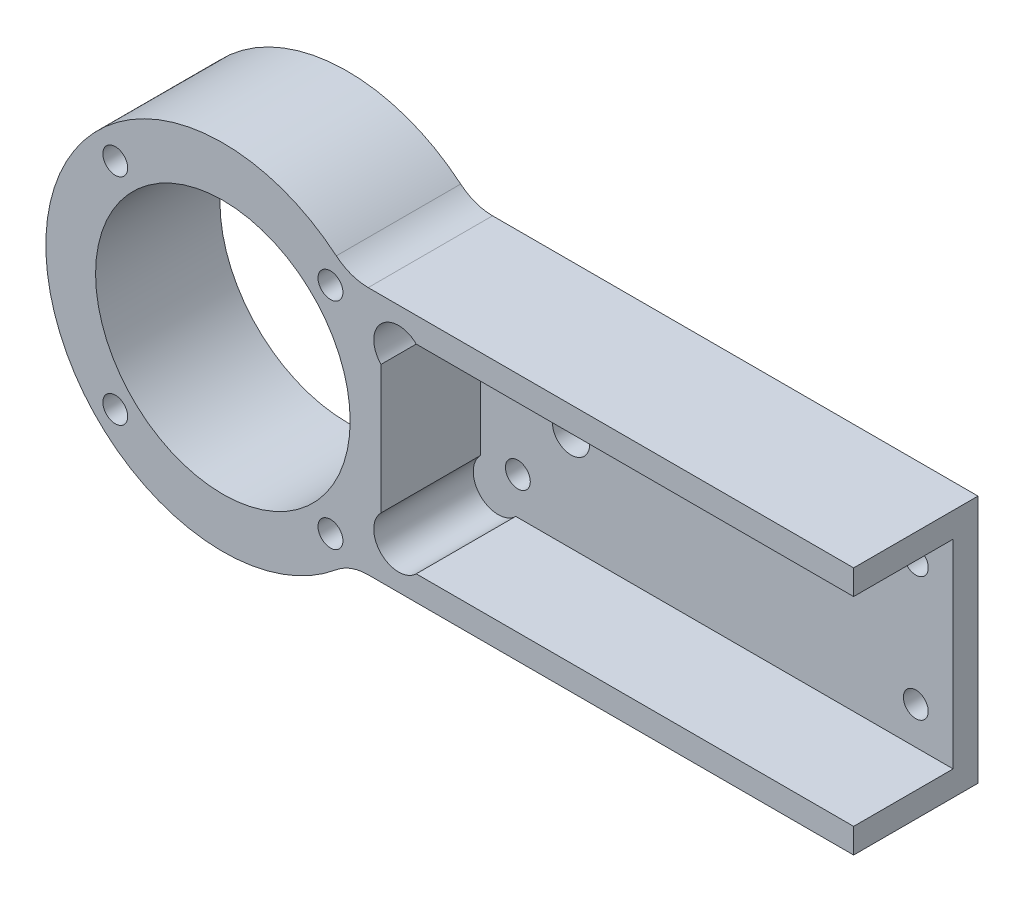
ISO-10303-21;
HEADER;
FILE_DESCRIPTION(('STEP AP214'),'2;1');
FILE_NAME('part.step','',(''),(''),'','','');
FILE_SCHEMA(('AUTOMOTIVE_DESIGN { 1 0 10303 214 1 1 1 1 }'));
ENDSEC;
DATA;
#1=APPLICATION_CONTEXT('core data for automotive mechanical design processes');
#2=APPLICATION_PROTOCOL_DEFINITION('international standard','automotive_design',2000,#1);
#3=PRODUCT_CONTEXT('',#1,'mechanical');
#4=PRODUCT('Part','Part','',(#3));
#5=PRODUCT_RELATED_PRODUCT_CATEGORY('part','',(#4));
#6=PRODUCT_DEFINITION_FORMATION('','',#4);
#7=PRODUCT_DEFINITION_CONTEXT('part definition',#1,'design');
#8=PRODUCT_DEFINITION('design','',#6,#7);
#9=PRODUCT_DEFINITION_SHAPE('','',#8);
#10=(LENGTH_UNIT() NAMED_UNIT(*) SI_UNIT(.MILLI.,.METRE.));
#11=(NAMED_UNIT(*) PLANE_ANGLE_UNIT() SI_UNIT($,.RADIAN.));
#12=(NAMED_UNIT(*) SI_UNIT($,.STERADIAN.) SOLID_ANGLE_UNIT());
#13=UNCERTAINTY_MEASURE_WITH_UNIT(LENGTH_MEASURE(1.E-05),#10,'distance_accuracy_value','');
#14=(GEOMETRIC_REPRESENTATION_CONTEXT(3) GLOBAL_UNCERTAINTY_ASSIGNED_CONTEXT((#13)) GLOBAL_UNIT_ASSIGNED_CONTEXT((#10,
#11,#12)) REPRESENTATION_CONTEXT('',''));
#15=CARTESIAN_POINT('',(0.,0.,0.));
#16=DIRECTION('',(0.,0.,1.));
#17=DIRECTION('',(1.,0.,0.));
#18=AXIS2_PLACEMENT_3D('',#15,#16,#17);
#19=CARTESIAN_POINT('',(161.036,7.03881397612349E-13,6.35));
#20=DIRECTION('',(-1.,0.,0.));
#21=DIRECTION('',(0.,-1.,0.));
#22=AXIS2_PLACEMENT_3D('',#19,#20,#21);
#23=PLANE('',#22);
#24=DIRECTION('',(0.,1.,0.));
#25=VECTOR('',#24,1.);
#26=CARTESIAN_POINT('',(161.036,7.03881397612349E-13,0.));
#27=LINE('',#26,#25);
#28=CARTESIAN_POINT('',(161.036,-31.75,0.));
#29=VERTEX_POINT('',#28);
#30=CARTESIAN_POINT('',(161.036,31.75,0.));
#31=VERTEX_POINT('',#30);
#32=EDGE_CURVE('E191',#29,#31,#27,.T.);
#33=ORIENTED_EDGE('',*,*,#32,.T.);
#34=DIRECTION('',(0.,0.,-1.));
#35=VECTOR('',#34,1.);
#36=CARTESIAN_POINT('',(161.036,31.75,6.35));
#37=LINE('',#36,#35);
#38=CARTESIAN_POINT('',(161.036,31.75,31.75));
#39=VERTEX_POINT('',#38);
#40=EDGE_CURVE('E209',#39,#31,#37,.T.);
#41=ORIENTED_EDGE('',*,*,#40,.F.);
#42=DIRECTION('',(0.,1.,0.));
#43=VECTOR('',#42,1.);
#44=CARTESIAN_POINT('',(161.036,-7.03881397612349E-13,31.75));
#45=LINE('',#44,#43);
#46=CARTESIAN_POINT('',(161.036,25.4,31.75));
#47=VERTEX_POINT('',#46);
#48=EDGE_CURVE('E188',#47,#39,#45,.T.);
#49=ORIENTED_EDGE('',*,*,#48,.F.);
#50=DIRECTION('',(0.,0.,-1.));
#51=VECTOR('',#50,1.);
#52=CARTESIAN_POINT('',(161.036,25.4,31.75));
#53=LINE('',#52,#51);
#54=CARTESIAN_POINT('',(161.036,25.4,6.35));
#55=VERTEX_POINT('',#54);
#56=EDGE_CURVE('E184',#47,#55,#53,.T.);
#57=ORIENTED_EDGE('',*,*,#56,.T.);
#58=DIRECTION('',(0.,1.,0.));
#59=VECTOR('',#58,1.);
#60=CARTESIAN_POINT('',(161.036,7.03881397612349E-13,6.35));
#61=LINE('',#60,#59);
#62=CARTESIAN_POINT('',(161.036,-25.4,6.35));
#63=VERTEX_POINT('',#62);
#64=EDGE_CURVE('E192',#63,#55,#61,.T.);
#65=ORIENTED_EDGE('',*,*,#64,.F.);
#66=DIRECTION('',(0.,0.,-1.));
#67=VECTOR('',#66,1.);
#68=CARTESIAN_POINT('',(161.036,-25.4,31.75));
#69=LINE('',#68,#67);
#70=CARTESIAN_POINT('',(161.036,-25.4,31.75));
#71=VERTEX_POINT('',#70);
#72=EDGE_CURVE('E187',#71,#63,#69,.T.);
#73=ORIENTED_EDGE('',*,*,#72,.F.);
#74=DIRECTION('',(0.,-1.,0.));
#75=VECTOR('',#74,1.);
#76=CARTESIAN_POINT('',(161.036,7.03881397612349E-13,31.75));
#77=LINE('',#76,#75);
#78=CARTESIAN_POINT('',(161.036,-31.75,31.75));
#79=VERTEX_POINT('',#78);
#80=EDGE_CURVE('E245',#71,#79,#77,.T.);
#81=ORIENTED_EDGE('',*,*,#80,.T.);
#82=DIRECTION('',(0.,0.,-1.));
#83=VECTOR('',#82,1.);
#84=CARTESIAN_POINT('',(161.036,-31.75,6.35));
#85=LINE('',#84,#83);
#86=EDGE_CURVE('E194',#79,#29,#85,.T.);
#87=ORIENTED_EDGE('',*,*,#86,.T.);
#88=EDGE_LOOP('',(#33,#41,#49,#57,#65,#73,#81,#87));
#89=FACE_BOUND('',#88,.T.);
#90=ADVANCED_FACE('F61',(#89),#23,.F.);
#91=CARTESIAN_POINT('',(0.,31.75,6.35));
#92=DIRECTION('',(0.,1.,0.));
#93=DIRECTION('',(0.,0.,1.));
#94=AXIS2_PLACEMENT_3D('',#91,#92,#93);
#95=PLANE('',#94);
#96=DIRECTION('',(1.,0.,0.));
#97=VECTOR('',#96,1.);
#98=CARTESIAN_POINT('',(0.,31.75,0.));
#99=LINE('',#98,#97);
#100=CARTESIAN_POINT('',(37.102661629592,31.75,0.));
#101=VERTEX_POINT('',#100);
#102=EDGE_CURVE('E198',#101,#31,#99,.T.);
#103=ORIENTED_EDGE('',*,*,#102,.F.);
#104=DIRECTION('',(0.,0.,-1.));
#105=VECTOR('',#104,1.);
#106=CARTESIAN_POINT('',(37.102661629592,31.75,6.35));
#107=LINE('',#106,#105);
#108=CARTESIAN_POINT('',(37.102661629592,31.75,31.75));
#109=VERTEX_POINT('',#108);
#110=EDGE_CURVE('E76',#101,#109,#107,.F.);
#111=ORIENTED_EDGE('',*,*,#110,.T.);
#112=DIRECTION('',(-1.,0.,0.));
#113=VECTOR('',#112,1.);
#114=CARTESIAN_POINT('',(0.,31.75,31.75));
#115=LINE('',#114,#113);
#116=EDGE_CURVE('E177',#39,#109,#115,.T.);
#117=ORIENTED_EDGE('',*,*,#116,.F.);
#118=ORIENTED_EDGE('',*,*,#40,.T.);
#119=EDGE_LOOP('',(#103,#111,#117,#118));
#120=FACE_BOUND('',#119,.T.);
#121=ADVANCED_FACE('F276',(#120),#95,.T.);
#122=CARTESIAN_POINT('',(0.,0.,6.35));
#123=DIRECTION('',(0.,0.,-1.));
#124=DIRECTION('',(-1.,0.,0.));
#125=AXIS2_PLACEMENT_3D('',#122,#123,#124);
#126=CYLINDRICAL_SURFACE('',#125,45.2);
#127=CARTESIAN_POINT('',(0.,0.,0.));
#128=DIRECTION('',(0.,0.,1.));
#129=DIRECTION('',(1.,0.,0.));
#130=AXIS2_PLACEMENT_3D('',#127,#128,#129);
#131=CIRCLE('',#130,45.2);
#132=CARTESIAN_POINT('',(28.9644266952946,34.7001727115717,0.));
#133=VERTEX_POINT('',#132);
#134=CARTESIAN_POINT('',(28.9644266952946,-34.7001727115717,0.));
#135=VERTEX_POINT('',#134);
#136=EDGE_CURVE('E200',#133,#135,#131,.T.);
#137=ORIENTED_EDGE('',*,*,#136,.T.);
#138=DIRECTION('',(0.,0.,-1.));
#139=VECTOR('',#138,1.);
#140=CARTESIAN_POINT('',(28.9644266952946,-34.7001727115717,6.35));
#141=LINE('',#140,#139);
#142=CARTESIAN_POINT('',(28.9644266952946,-34.7001727115717,31.75));
#143=VERTEX_POINT('',#142);
#144=EDGE_CURVE('E221',#135,#143,#141,.F.);
#145=ORIENTED_EDGE('',*,*,#144,.T.);
#146=CARTESIAN_POINT('',(0.,0.,31.75));
#147=DIRECTION('',(0.,0.,1.));
#148=DIRECTION('',(1.,0.,0.));
#149=AXIS2_PLACEMENT_3D('',#146,#147,#148);
#150=CIRCLE('',#149,45.2);
#151=CARTESIAN_POINT('',(28.9644266952946,34.7001727115717,31.75));
#152=VERTEX_POINT('',#151);
#153=EDGE_CURVE('E238',#152,#143,#150,.T.);
#154=ORIENTED_EDGE('',*,*,#153,.F.);
#155=DIRECTION('',(0.,0.,-1.));
#156=VECTOR('',#155,1.);
#157=CARTESIAN_POINT('',(28.9644266952946,34.7001727115717,6.35));
#158=LINE('',#157,#156);
#159=EDGE_CURVE('E218',#152,#133,#158,.T.);
#160=ORIENTED_EDGE('',*,*,#159,.T.);
#161=EDGE_LOOP('',(#137,#145,#154,#160));
#162=FACE_BOUND('',#161,.T.);
#163=ADVANCED_FACE('F252',(#162),#126,.T.);
#164=CARTESIAN_POINT('',(0.,-31.75,6.35));
#165=DIRECTION('',(0.,1.,0.));
#166=DIRECTION('',(0.,0.,1.));
#167=AXIS2_PLACEMENT_3D('',#164,#165,#166);
#168=PLANE('',#167);
#169=DIRECTION('',(-1.,0.,0.));
#170=VECTOR('',#169,1.);
#171=CARTESIAN_POINT('',(0.,-31.75,31.75));
#172=LINE('',#171,#170);
#173=CARTESIAN_POINT('',(37.102661629592,-31.75,31.75));
#174=VERTEX_POINT('',#173);
#175=EDGE_CURVE('E235',#79,#174,#172,.T.);
#176=ORIENTED_EDGE('',*,*,#175,.T.);
#177=DIRECTION('',(0.,0.,1.));
#178=VECTOR('',#177,1.);
#179=CARTESIAN_POINT('',(37.102661629592,-31.75,0.));
#180=LINE('',#179,#178);
#181=CARTESIAN_POINT('',(37.102661629592,-31.75,0.));
#182=VERTEX_POINT('',#181);
#183=EDGE_CURVE('E215',#174,#182,#180,.F.);
#184=ORIENTED_EDGE('',*,*,#183,.T.);
#185=DIRECTION('',(1.,0.,0.));
#186=VECTOR('',#185,1.);
#187=CARTESIAN_POINT('',(0.,-31.75,0.));
#188=LINE('',#187,#186);
#189=EDGE_CURVE('E203',#182,#29,#188,.T.);
#190=ORIENTED_EDGE('',*,*,#189,.T.);
#191=ORIENTED_EDGE('',*,*,#86,.F.);
#192=EDGE_LOOP('',(#176,#184,#190,#191));
#193=FACE_BOUND('',#192,.T.);
#194=ADVANCED_FACE('F243',(#193),#168,.F.);
#195=CARTESIAN_POINT('',(0.,0.,6.35));
#196=DIRECTION('',(0.,0.,-1.));
#197=DIRECTION('',(-1.,0.,0.));
#198=AXIS2_PLACEMENT_3D('',#195,#196,#197);
#199=CYLINDRICAL_SURFACE('',#198,32.5);
#200=CARTESIAN_POINT('',(0.,0.,0.));
#201=DIRECTION('',(0.,0.,1.));
#202=DIRECTION('',(1.,0.,0.));
#203=AXIS2_PLACEMENT_3D('',#200,#201,#202);
#204=CIRCLE('',#203,32.5);
#205=CARTESIAN_POINT('',(32.5,0.,0.));
#206=VERTEX_POINT('',#205);
#207=EDGE_CURVE('E195',#206,#206,#204,.T.);
#208=ORIENTED_EDGE('',*,*,#207,.F.);
#209=EDGE_LOOP('',(#208));
#210=FACE_BOUND('',#209,.T.);
#211=CARTESIAN_POINT('',(0.,0.,31.75));
#212=DIRECTION('',(0.,0.,1.));
#213=DIRECTION('',(1.,0.,0.));
#214=AXIS2_PLACEMENT_3D('',#211,#212,#213);
#215=CIRCLE('',#214,32.5);
#216=CARTESIAN_POINT('',(32.5,0.,31.75));
#217=VERTEX_POINT('',#216);
#218=EDGE_CURVE('E180',#217,#217,#215,.T.);
#219=ORIENTED_EDGE('',*,*,#218,.T.);
#220=EDGE_LOOP('',(#219));
#221=FACE_BOUND('',#220,.T.);
#222=ADVANCED_FACE('F349',(#210,#221),#199,.F.);
#223=CARTESIAN_POINT('',(0.,0.,6.35));
#224=DIRECTION('',(0.,0.,1.));
#225=DIRECTION('',(1.,0.,0.));
#226=AXIS2_PLACEMENT_3D('',#223,#224,#225);
#227=PLANE('',#226);
#228=CARTESIAN_POINT('',(63.5,0.,6.35));
#229=DIRECTION('',(0.,0.,-1.));
#230=DIRECTION('',(-1.,0.,0.));
#231=AXIS2_PLACEMENT_3D('',#228,#229,#230);
#232=CIRCLE('',#231,4.7625);
#233=CARTESIAN_POINT('',(58.7375,0.,6.35));
#234=VERTEX_POINT('',#233);
#235=EDGE_CURVE('E590',#234,#234,#232,.T.);
#236=ORIENTED_EDGE('',*,*,#235,.T.);
#237=EDGE_LOOP('',(#236));
#238=FACE_BOUND('',#237,.T.);
#239=CARTESIAN_POINT('',(49.911,15.875,6.35));
#240=DIRECTION('',(0.,0.,1.));
#241=DIRECTION('',(1.,0.,0.));
#242=AXIS2_PLACEMENT_3D('',#239,#240,#241);
#243=CIRCLE('',#242,3.175);
#244=CARTESIAN_POINT('',(53.086,15.875,6.35));
#245=VERTEX_POINT('',#244);
#246=EDGE_CURVE('E536',#245,#245,#243,.T.);
#247=ORIENTED_EDGE('',*,*,#246,.F.);
#248=EDGE_LOOP('',(#247));
#249=FACE_BOUND('',#248,.T.);
#250=DIRECTION('',(0.,1.,0.));
#251=VECTOR('',#250,1.);
#252=CARTESIAN_POINT('',(40.386,0.,6.35));
#253=LINE('',#252,#251);
#254=CARTESIAN_POINT('',(40.386,-16.4197438789308,6.35));
#255=VERTEX_POINT('',#254);
#256=CARTESIAN_POINT('',(40.386,16.4197438789308,6.35));
#257=VERTEX_POINT('',#256);
#258=EDGE_CURVE('E167',#255,#257,#253,.T.);
#259=ORIENTED_EDGE('',*,*,#258,.F.);
#260=CARTESIAN_POINT('',(44.8761280605346,-20.9098719394654,6.35));
#261=DIRECTION('',(0.,0.,1.));
#262=DIRECTION('',(1.,0.,0.));
#263=AXIS2_PLACEMENT_3D('',#260,#261,#262);
#264=CIRCLE('',#263,6.35);
#265=CARTESIAN_POINT('',(49.3662561210691,-25.4,6.35));
#266=VERTEX_POINT('',#265);
#267=EDGE_CURVE('E587',#266,#255,#264,.F.);
#268=ORIENTED_EDGE('',*,*,#267,.F.);
#269=DIRECTION('',(-1.,0.,0.));
#270=VECTOR('',#269,1.);
#271=CARTESIAN_POINT('',(0.,-25.4,6.35));
#272=LINE('',#271,#270);
#273=EDGE_CURVE('E175',#63,#266,#272,.T.);
#274=ORIENTED_EDGE('',*,*,#273,.F.);
#275=ORIENTED_EDGE('',*,*,#64,.T.);
#276=DIRECTION('',(1.,0.,0.));
#277=VECTOR('',#276,1.);
#278=CARTESIAN_POINT('',(0.,25.4,6.35));
#279=LINE('',#278,#277);
#280=CARTESIAN_POINT('',(49.3662561210691,25.4,6.35));
#281=VERTEX_POINT('',#280);
#282=EDGE_CURVE('E169',#281,#55,#279,.T.);
#283=ORIENTED_EDGE('',*,*,#282,.F.);
#284=CARTESIAN_POINT('',(44.8761280605346,20.9098719394654,6.35));
#285=DIRECTION('',(0.,0.,1.));
#286=DIRECTION('',(1.,0.,0.));
#287=AXIS2_PLACEMENT_3D('',#284,#285,#286);
#288=CIRCLE('',#287,6.35);
#289=EDGE_CURVE('E152',#257,#281,#288,.F.);
#290=ORIENTED_EDGE('',*,*,#289,.F.);
#291=EDGE_LOOP('',(#259,#268,#274,#275,#283,#290));
#292=FACE_BOUND('',#291,.T.);
#293=CARTESIAN_POINT('',(49.911,-15.875,6.35));
#294=DIRECTION('',(0.,0.,1.));
#295=DIRECTION('',(1.,0.,0.));
#296=AXIS2_PLACEMENT_3D('',#293,#294,#295);
#297=CIRCLE('',#296,3.175);
#298=CARTESIAN_POINT('',(53.086,-15.875,6.35));
#299=VERTEX_POINT('',#298);
#300=EDGE_CURVE('E546',#299,#299,#297,.T.);
#301=ORIENTED_EDGE('',*,*,#300,.F.);
#302=EDGE_LOOP('',(#301));
#303=FACE_BOUND('',#302,.T.);
#304=CARTESIAN_POINT('',(151.511,15.875,6.35));
#305=DIRECTION('',(0.,0.,1.));
#306=DIRECTION('',(1.,0.,0.));
#307=AXIS2_PLACEMENT_3D('',#304,#305,#306);
#308=CIRCLE('',#307,3.175);
#309=CARTESIAN_POINT('',(154.686,15.875,6.35));
#310=VERTEX_POINT('',#309);
#311=EDGE_CURVE('E538',#310,#310,#308,.T.);
#312=ORIENTED_EDGE('',*,*,#311,.F.);
#313=EDGE_LOOP('',(#312));
#314=FACE_BOUND('',#313,.T.);
#315=CARTESIAN_POINT('',(151.511,-15.875,6.35));
#316=DIRECTION('',(0.,0.,1.));
#317=DIRECTION('',(1.,0.,0.));
#318=AXIS2_PLACEMENT_3D('',#315,#316,#317);
#319=CIRCLE('',#318,3.175);
#320=CARTESIAN_POINT('',(154.686,-15.875,6.35));
#321=VERTEX_POINT('',#320);
#322=EDGE_CURVE('E541',#321,#321,#319,.T.);
#323=ORIENTED_EDGE('',*,*,#322,.F.);
#324=EDGE_LOOP('',(#323));
#325=FACE_BOUND('',#324,.T.);
#326=ADVANCED_FACE('F164',(#238,#249,#292,#303,#314,#325),#227,.T.);
#327=CARTESIAN_POINT('',(0.,0.,0.));
#328=DIRECTION('',(0.,0.,1.));
#329=DIRECTION('',(1.,0.,0.));
#330=AXIS2_PLACEMENT_3D('',#327,#328,#329);
#331=PLANE('',#330);
#332=CARTESIAN_POINT('',(63.5,0.,0.));
#333=DIRECTION('',(0.,0.,-1.));
#334=DIRECTION('',(-1.,0.,0.));
#335=AXIS2_PLACEMENT_3D('',#332,#333,#334);
#336=CIRCLE('',#335,4.7625);
#337=CARTESIAN_POINT('',(58.7375,0.,0.));
#338=VERTEX_POINT('',#337);
#339=EDGE_CURVE('E593',#338,#338,#336,.T.);
#340=ORIENTED_EDGE('',*,*,#339,.F.);
#341=EDGE_LOOP('',(#340));
#342=FACE_BOUND('',#341,.T.);
#343=CARTESIAN_POINT('',(-27.4710984490973,-27.4710984490974,0.));
#344=DIRECTION('',(0.,0.,1.));
#345=DIRECTION('',(1.,0.,0.));
#346=AXIS2_PLACEMENT_3D('',#343,#344,#345);
#347=CIRCLE('',#346,3.175);
#348=CARTESIAN_POINT('',(-24.2960984490973,-27.4710984490974,0.));
#349=VERTEX_POINT('',#348);
#350=EDGE_CURVE('E555',#349,#349,#347,.T.);
#351=ORIENTED_EDGE('',*,*,#350,.T.);
#352=EDGE_LOOP('',(#351));
#353=FACE_BOUND('',#352,.T.);
#354=CARTESIAN_POINT('',(49.911,15.875,0.));
#355=DIRECTION('',(0.,0.,1.));
#356=DIRECTION('',(1.,0.,0.));
#357=AXIS2_PLACEMENT_3D('',#354,#355,#356);
#358=CIRCLE('',#357,3.175);
#359=CARTESIAN_POINT('',(53.086,15.875,0.));
#360=VERTEX_POINT('',#359);
#361=EDGE_CURVE('E563',#360,#360,#358,.T.);
#362=ORIENTED_EDGE('',*,*,#361,.T.);
#363=EDGE_LOOP('',(#362));
#364=FACE_BOUND('',#363,.T.);
#365=CARTESIAN_POINT('',(151.511,15.875,0.));
#366=DIRECTION('',(0.,0.,1.));
#367=DIRECTION('',(1.,0.,0.));
#368=AXIS2_PLACEMENT_3D('',#365,#366,#367);
#369=CIRCLE('',#368,3.175);
#370=CARTESIAN_POINT('',(154.686,15.875,0.));
#371=VERTEX_POINT('',#370);
#372=EDGE_CURVE('E559',#371,#371,#369,.T.);
#373=ORIENTED_EDGE('',*,*,#372,.T.);
#374=EDGE_LOOP('',(#373));
#375=FACE_BOUND('',#374,.T.);
#376=CARTESIAN_POINT('',(151.511,-15.875,0.));
#377=DIRECTION('',(0.,0.,1.));
#378=DIRECTION('',(1.,0.,0.));
#379=AXIS2_PLACEMENT_3D('',#376,#377,#378);
#380=CIRCLE('',#379,3.175);
#381=CARTESIAN_POINT('',(154.686,-15.875,0.));
#382=VERTEX_POINT('',#381);
#383=EDGE_CURVE('E556',#382,#382,#380,.T.);
#384=ORIENTED_EDGE('',*,*,#383,.T.);
#385=EDGE_LOOP('',(#384));
#386=FACE_BOUND('',#385,.T.);
#387=CARTESIAN_POINT('',(49.911,-15.875,0.));
#388=DIRECTION('',(0.,0.,1.));
#389=DIRECTION('',(1.,0.,0.));
#390=AXIS2_PLACEMENT_3D('',#387,#388,#389);
#391=CIRCLE('',#390,3.175);
#392=CARTESIAN_POINT('',(53.086,-15.875,0.));
#393=VERTEX_POINT('',#392);
#394=EDGE_CURVE('E560',#393,#393,#391,.T.);
#395=ORIENTED_EDGE('',*,*,#394,.T.);
#396=EDGE_LOOP('',(#395));
#397=FACE_BOUND('',#396,.T.);
#398=CARTESIAN_POINT('',(27.4710984490973,27.4710984490974,0.));
#399=DIRECTION('',(0.,0.,1.));
#400=DIRECTION('',(1.,0.,0.));
#401=AXIS2_PLACEMENT_3D('',#398,#399,#400);
#402=CIRCLE('',#401,3.175);
#403=CARTESIAN_POINT('',(30.6460984490973,27.4710984490974,0.));
#404=VERTEX_POINT('',#403);
#405=EDGE_CURVE('E578',#404,#404,#402,.T.);
#406=ORIENTED_EDGE('',*,*,#405,.T.);
#407=EDGE_LOOP('',(#406));
#408=FACE_BOUND('',#407,.T.);
#409=CARTESIAN_POINT('',(-27.4710984490975,27.4710984490972,0.));
#410=DIRECTION('',(0.,0.,1.));
#411=DIRECTION('',(1.,0.,0.));
#412=AXIS2_PLACEMENT_3D('',#409,#410,#411);
#413=CIRCLE('',#412,3.175);
#414=CARTESIAN_POINT('',(-24.2960984490975,27.4710984490972,0.));
#415=VERTEX_POINT('',#414);
#416=EDGE_CURVE('E571',#415,#415,#413,.T.);
#417=ORIENTED_EDGE('',*,*,#416,.T.);
#418=EDGE_LOOP('',(#417));
#419=FACE_BOUND('',#418,.T.);
#420=CARTESIAN_POINT('',(27.4710984490975,-27.4710984490972,0.));
#421=DIRECTION('',(0.,0.,1.));
#422=DIRECTION('',(1.,0.,0.));
#423=AXIS2_PLACEMENT_3D('',#420,#421,#422);
#424=CIRCLE('',#423,3.17500000000001);
#425=CARTESIAN_POINT('',(30.6460984490975,-27.4710984490972,0.));
#426=VERTEX_POINT('',#425);
#427=EDGE_CURVE('E549',#426,#426,#424,.T.);
#428=ORIENTED_EDGE('',*,*,#427,.T.);
#429=EDGE_LOOP('',(#428));
#430=FACE_BOUND('',#429,.T.);
#431=ORIENTED_EDGE('',*,*,#32,.F.);
#432=ORIENTED_EDGE('',*,*,#189,.F.);
#433=CARTESIAN_POINT('',(37.102661629592,-44.45,0.));
#434=DIRECTION('',(0.,0.,1.));
#435=DIRECTION('',(1.,0.,0.));
#436=AXIS2_PLACEMENT_3D('',#433,#434,#435);
#437=CIRCLE('',#436,12.7);
#438=EDGE_CURVE('E224',#182,#135,#437,.T.);
#439=ORIENTED_EDGE('',*,*,#438,.T.);
#440=ORIENTED_EDGE('',*,*,#136,.F.);
#441=CARTESIAN_POINT('',(37.102661629592,44.45,0.));
#442=DIRECTION('',(0.,0.,1.));
#443=DIRECTION('',(1.,0.,0.));
#444=AXIS2_PLACEMENT_3D('',#441,#442,#443);
#445=CIRCLE('',#444,12.7);
#446=EDGE_CURVE('E69',#133,#101,#445,.T.);
#447=ORIENTED_EDGE('',*,*,#446,.T.);
#448=ORIENTED_EDGE('',*,*,#102,.T.);
#449=EDGE_LOOP('',(#431,#432,#439,#440,#447,#448));
#450=FACE_BOUND('',#449,.T.);
#451=ORIENTED_EDGE('',*,*,#207,.T.);
#452=EDGE_LOOP('',(#451));
#453=FACE_BOUND('',#452,.T.);
#454=ADVANCED_FACE('F249',(#342,#353,#364,#375,#386,#397,#408,#419,#430,#450,#453),#331,.F.);
#455=CARTESIAN_POINT('',(0.,0.,31.75));
#456=DIRECTION('',(0.,0.,1.));
#457=DIRECTION('',(1.,0.,0.));
#458=AXIS2_PLACEMENT_3D('',#455,#456,#457);
#459=PLANE('',#458);
#460=CARTESIAN_POINT('',(44.8761280605346,20.9098719394654,31.75));
#461=DIRECTION('',(0.,0.,1.));
#462=DIRECTION('',(1.,0.,0.));
#463=AXIS2_PLACEMENT_3D('',#460,#461,#462);
#464=CIRCLE('',#463,6.35);
#465=CARTESIAN_POINT('',(49.3662561210691,25.4,31.75));
#466=VERTEX_POINT('',#465);
#467=CARTESIAN_POINT('',(40.386,16.4197438789308,31.75));
#468=VERTEX_POINT('',#467);
#469=EDGE_CURVE('E154',#466,#468,#464,.T.);
#470=ORIENTED_EDGE('',*,*,#469,.F.);
#471=DIRECTION('',(1.,0.,0.));
#472=VECTOR('',#471,1.);
#473=CARTESIAN_POINT('',(0.,25.4,31.75));
#474=LINE('',#473,#472);
#475=EDGE_CURVE('E269',#466,#47,#474,.T.);
#476=ORIENTED_EDGE('',*,*,#475,.T.);
#477=ORIENTED_EDGE('',*,*,#48,.T.);
#478=ORIENTED_EDGE('',*,*,#116,.T.);
#479=CARTESIAN_POINT('',(37.102661629592,44.45,31.75));
#480=DIRECTION('',(0.,0.,1.));
#481=DIRECTION('',(1.,0.,0.));
#482=AXIS2_PLACEMENT_3D('',#479,#480,#481);
#483=CIRCLE('',#482,12.7);
#484=EDGE_CURVE('E12',#109,#152,#483,.F.);
#485=ORIENTED_EDGE('',*,*,#484,.T.);
#486=ORIENTED_EDGE('',*,*,#153,.T.);
#487=CARTESIAN_POINT('',(37.102661629592,-44.45,31.75));
#488=DIRECTION('',(0.,0.,1.));
#489=DIRECTION('',(1.,0.,0.));
#490=AXIS2_PLACEMENT_3D('',#487,#488,#489);
#491=CIRCLE('',#490,12.7);
#492=EDGE_CURVE('E226',#143,#174,#491,.F.);
#493=ORIENTED_EDGE('',*,*,#492,.T.);
#494=ORIENTED_EDGE('',*,*,#175,.F.);
#495=ORIENTED_EDGE('',*,*,#80,.F.);
#496=DIRECTION('',(-1.,0.,0.));
#497=VECTOR('',#496,1.);
#498=CARTESIAN_POINT('',(0.,-25.4,31.75));
#499=LINE('',#498,#497);
#500=CARTESIAN_POINT('',(49.3662561210691,-25.4,31.75));
#501=VERTEX_POINT('',#500);
#502=EDGE_CURVE('E264',#71,#501,#499,.T.);
#503=ORIENTED_EDGE('',*,*,#502,.T.);
#504=CARTESIAN_POINT('',(44.8761280605346,-20.9098719394654,31.75));
#505=DIRECTION('',(0.,0.,1.));
#506=DIRECTION('',(-1.,0.,0.));
#507=AXIS2_PLACEMENT_3D('',#504,#505,#506);
#508=CIRCLE('',#507,6.35);
#509=CARTESIAN_POINT('',(40.386,-16.4197438789308,31.75));
#510=VERTEX_POINT('',#509);
#511=EDGE_CURVE('E589',#510,#501,#508,.T.);
#512=ORIENTED_EDGE('',*,*,#511,.F.);
#513=DIRECTION('',(0.,1.,0.));
#514=VECTOR('',#513,1.);
#515=CARTESIAN_POINT('',(40.386,0.,31.75));
#516=LINE('',#515,#514);
#517=EDGE_CURVE('E267',#510,#468,#516,.T.);
#518=ORIENTED_EDGE('',*,*,#517,.T.);
#519=EDGE_LOOP('',(#470,#476,#477,#478,#485,#486,#493,#494,#495,#503,#512,#518));
#520=FACE_BOUND('',#519,.T.);
#521=CARTESIAN_POINT('',(-27.4710984490973,-27.4710984490974,31.75));
#522=DIRECTION('',(0.,0.,1.));
#523=DIRECTION('',(1.,0.,0.));
#524=AXIS2_PLACEMENT_3D('',#521,#522,#523);
#525=CIRCLE('',#524,3.175);
#526=CARTESIAN_POINT('',(-24.2960984490973,-27.4710984490974,31.75));
#527=VERTEX_POINT('',#526);
#528=EDGE_CURVE('E566',#527,#527,#525,.T.);
#529=ORIENTED_EDGE('',*,*,#528,.F.);
#530=EDGE_LOOP('',(#529));
#531=FACE_BOUND('',#530,.T.);
#532=CARTESIAN_POINT('',(27.4710984490973,27.4710984490974,31.75));
#533=DIRECTION('',(0.,0.,1.));
#534=DIRECTION('',(1.,0.,0.));
#535=AXIS2_PLACEMENT_3D('',#532,#533,#534);
#536=CIRCLE('',#535,3.175);
#537=CARTESIAN_POINT('',(30.6460984490973,27.4710984490974,31.75));
#538=VERTEX_POINT('',#537);
#539=EDGE_CURVE('E574',#538,#538,#536,.T.);
#540=ORIENTED_EDGE('',*,*,#539,.F.);
#541=EDGE_LOOP('',(#540));
#542=FACE_BOUND('',#541,.T.);
#543=CARTESIAN_POINT('',(-27.4710984490975,27.4710984490972,31.75));
#544=DIRECTION('',(0.,0.,1.));
#545=DIRECTION('',(1.,0.,0.));
#546=AXIS2_PLACEMENT_3D('',#543,#544,#545);
#547=CIRCLE('',#546,3.175);
#548=CARTESIAN_POINT('',(-24.2960984490975,27.4710984490972,31.75));
#549=VERTEX_POINT('',#548);
#550=EDGE_CURVE('E575',#549,#549,#547,.T.);
#551=ORIENTED_EDGE('',*,*,#550,.F.);
#552=EDGE_LOOP('',(#551));
#553=FACE_BOUND('',#552,.T.);
#554=CARTESIAN_POINT('',(27.4710984490975,-27.4710984490972,31.75));
#555=DIRECTION('',(0.,0.,1.));
#556=DIRECTION('',(1.,0.,0.));
#557=AXIS2_PLACEMENT_3D('',#554,#555,#556);
#558=CIRCLE('',#557,3.17500000000001);
#559=CARTESIAN_POINT('',(30.6460984490975,-27.4710984490972,31.75));
#560=VERTEX_POINT('',#559);
#561=EDGE_CURVE('E552',#560,#560,#558,.T.);
#562=ORIENTED_EDGE('',*,*,#561,.F.);
#563=EDGE_LOOP('',(#562));
#564=FACE_BOUND('',#563,.T.);
#565=ORIENTED_EDGE('',*,*,#218,.F.);
#566=EDGE_LOOP('',(#565));
#567=FACE_BOUND('',#566,.T.);
#568=ADVANCED_FACE('F232',(#520,#531,#542,#553,#564,#567),#459,.T.);
#569=CARTESIAN_POINT('',(0.,-25.4,31.75));
#570=DIRECTION('',(0.,-1.,0.));
#571=DIRECTION('',(0.,0.,-1.));
#572=AXIS2_PLACEMENT_3D('',#569,#570,#571);
#573=PLANE('',#572);
#574=ORIENTED_EDGE('',*,*,#273,.T.);
#575=DIRECTION('',(0.,0.,1.));
#576=VECTOR('',#575,1.);
#577=CARTESIAN_POINT('',(49.3662561210691,-25.4,-11.6105122421383));
#578=LINE('',#577,#576);
#579=EDGE_CURVE('E159',#266,#501,#578,.T.);
#580=ORIENTED_EDGE('',*,*,#579,.T.);
#581=ORIENTED_EDGE('',*,*,#502,.F.);
#582=ORIENTED_EDGE('',*,*,#72,.T.);
#583=EDGE_LOOP('',(#574,#580,#581,#582));
#584=FACE_BOUND('',#583,.T.);
#585=ADVANCED_FACE('F339',(#584),#573,.F.);
#586=CARTESIAN_POINT('',(40.386,0.,31.75));
#587=DIRECTION('',(-1.,0.,0.));
#588=DIRECTION('',(0.,0.,1.));
#589=AXIS2_PLACEMENT_3D('',#586,#587,#588);
#590=PLANE('',#589);
#591=ORIENTED_EDGE('',*,*,#258,.T.);
#592=DIRECTION('',(0.,0.,1.));
#593=VECTOR('',#592,1.);
#594=CARTESIAN_POINT('',(40.386,16.4197438789308,-11.6105122421383));
#595=LINE('',#594,#593);
#596=EDGE_CURVE('E148',#257,#468,#595,.T.);
#597=ORIENTED_EDGE('',*,*,#596,.T.);
#598=ORIENTED_EDGE('',*,*,#517,.F.);
#599=DIRECTION('',(0.,0.,1.));
#600=VECTOR('',#599,1.);
#601=CARTESIAN_POINT('',(40.386,-16.4197438789308,-11.6105122421383));
#602=LINE('',#601,#600);
#603=EDGE_CURVE('E174',#510,#255,#602,.F.);
#604=ORIENTED_EDGE('',*,*,#603,.T.);
#605=EDGE_LOOP('',(#591,#597,#598,#604));
#606=FACE_BOUND('',#605,.T.);
#607=ADVANCED_FACE('F172',(#606),#590,.F.);
#608=CARTESIAN_POINT('',(0.,25.4,31.75));
#609=DIRECTION('',(0.,1.,0.));
#610=DIRECTION('',(0.,0.,1.));
#611=AXIS2_PLACEMENT_3D('',#608,#609,#610);
#612=PLANE('',#611);
#613=ORIENTED_EDGE('',*,*,#475,.F.);
#614=DIRECTION('',(0.,0.,1.));
#615=VECTOR('',#614,1.);
#616=CARTESIAN_POINT('',(49.3662561210691,25.4,-11.6105122421383));
#617=LINE('',#616,#615);
#618=EDGE_CURVE('E212',#466,#281,#617,.F.);
#619=ORIENTED_EDGE('',*,*,#618,.T.);
#620=ORIENTED_EDGE('',*,*,#282,.T.);
#621=ORIENTED_EDGE('',*,*,#56,.F.);
#622=EDGE_LOOP('',(#613,#619,#620,#621));
#623=FACE_BOUND('',#622,.T.);
#624=ADVANCED_FACE('F273',(#623),#612,.F.);
#625=CARTESIAN_POINT('',(27.4710984490975,-27.4710984490972,0.));
#626=DIRECTION('',(0.,0.,1.));
#627=DIRECTION('',(1.,0.,0.));
#628=AXIS2_PLACEMENT_3D('',#625,#626,#627);
#629=CYLINDRICAL_SURFACE('',#628,3.17500000000001);
#630=ORIENTED_EDGE('',*,*,#427,.F.);
#631=EDGE_LOOP('',(#630));
#632=FACE_BOUND('',#631,.T.);
#633=ORIENTED_EDGE('',*,*,#561,.T.);
#634=EDGE_LOOP('',(#633));
#635=FACE_BOUND('',#634,.T.);
#636=ADVANCED_FACE('F319',(#632,#635),#629,.F.);
#637=CARTESIAN_POINT('',(-27.4710984490975,27.4710984490972,0.));
#638=DIRECTION('',(0.,0.,1.));
#639=DIRECTION('',(1.,0.,0.));
#640=AXIS2_PLACEMENT_3D('',#637,#638,#639);
#641=CYLINDRICAL_SURFACE('',#640,3.175);
#642=ORIENTED_EDGE('',*,*,#416,.F.);
#643=EDGE_LOOP('',(#642));
#644=FACE_BOUND('',#643,.T.);
#645=ORIENTED_EDGE('',*,*,#550,.T.);
#646=EDGE_LOOP('',(#645));
#647=FACE_BOUND('',#646,.T.);
#648=ADVANCED_FACE('F315',(#644,#647),#641,.F.);
#649=CARTESIAN_POINT('',(27.4710984490973,27.4710984490974,0.));
#650=DIRECTION('',(0.,0.,1.));
#651=DIRECTION('',(1.,0.,0.));
#652=AXIS2_PLACEMENT_3D('',#649,#650,#651);
#653=CYLINDRICAL_SURFACE('',#652,3.175);
#654=ORIENTED_EDGE('',*,*,#405,.F.);
#655=EDGE_LOOP('',(#654));
#656=FACE_BOUND('',#655,.T.);
#657=ORIENTED_EDGE('',*,*,#539,.T.);
#658=EDGE_LOOP('',(#657));
#659=FACE_BOUND('',#658,.T.);
#660=ADVANCED_FACE('F312',(#656,#659),#653,.F.);
#661=CARTESIAN_POINT('',(-27.4710984490973,-27.4710984490974,0.));
#662=DIRECTION('',(0.,0.,1.));
#663=DIRECTION('',(1.,0.,0.));
#664=AXIS2_PLACEMENT_3D('',#661,#662,#663);
#665=CYLINDRICAL_SURFACE('',#664,3.175);
#666=ORIENTED_EDGE('',*,*,#350,.F.);
#667=EDGE_LOOP('',(#666));
#668=FACE_BOUND('',#667,.T.);
#669=ORIENTED_EDGE('',*,*,#528,.T.);
#670=EDGE_LOOP('',(#669));
#671=FACE_BOUND('',#670,.T.);
#672=ADVANCED_FACE('F310',(#668,#671),#665,.F.);
#673=CARTESIAN_POINT('',(49.911,-15.875,0.));
#674=DIRECTION('',(0.,0.,1.));
#675=DIRECTION('',(1.,0.,0.));
#676=AXIS2_PLACEMENT_3D('',#673,#674,#675);
#677=CYLINDRICAL_SURFACE('',#676,3.175);
#678=ORIENTED_EDGE('',*,*,#300,.T.);
#679=EDGE_LOOP('',(#678));
#680=FACE_BOUND('',#679,.T.);
#681=ORIENTED_EDGE('',*,*,#394,.F.);
#682=EDGE_LOOP('',(#681));
#683=FACE_BOUND('',#682,.T.);
#684=ADVANCED_FACE('F306',(#680,#683),#677,.F.);
#685=CARTESIAN_POINT('',(151.511,-15.875,0.));
#686=DIRECTION('',(0.,0.,1.));
#687=DIRECTION('',(1.,0.,0.));
#688=AXIS2_PLACEMENT_3D('',#685,#686,#687);
#689=CYLINDRICAL_SURFACE('',#688,3.175);
#690=ORIENTED_EDGE('',*,*,#322,.T.);
#691=EDGE_LOOP('',(#690));
#692=FACE_BOUND('',#691,.T.);
#693=ORIENTED_EDGE('',*,*,#383,.F.);
#694=EDGE_LOOP('',(#693));
#695=FACE_BOUND('',#694,.T.);
#696=ADVANCED_FACE('F309',(#692,#695),#689,.F.);
#697=CARTESIAN_POINT('',(151.511,15.875,0.));
#698=DIRECTION('',(0.,0.,1.));
#699=DIRECTION('',(1.,0.,0.));
#700=AXIS2_PLACEMENT_3D('',#697,#698,#699);
#701=CYLINDRICAL_SURFACE('',#700,3.175);
#702=ORIENTED_EDGE('',*,*,#311,.T.);
#703=EDGE_LOOP('',(#702));
#704=FACE_BOUND('',#703,.T.);
#705=ORIENTED_EDGE('',*,*,#372,.F.);
#706=EDGE_LOOP('',(#705));
#707=FACE_BOUND('',#706,.T.);
#708=ADVANCED_FACE('F326',(#704,#707),#701,.F.);
#709=CARTESIAN_POINT('',(49.911,15.875,0.));
#710=DIRECTION('',(0.,0.,1.));
#711=DIRECTION('',(1.,0.,0.));
#712=AXIS2_PLACEMENT_3D('',#709,#710,#711);
#713=CYLINDRICAL_SURFACE('',#712,3.175);
#714=ORIENTED_EDGE('',*,*,#246,.T.);
#715=EDGE_LOOP('',(#714));
#716=FACE_BOUND('',#715,.T.);
#717=ORIENTED_EDGE('',*,*,#361,.F.);
#718=EDGE_LOOP('',(#717));
#719=FACE_BOUND('',#718,.T.);
#720=ADVANCED_FACE('F304',(#716,#719),#713,.F.);
#721=CARTESIAN_POINT('',(44.8761280605346,20.9098719394654,-11.6105122421383));
#722=DIRECTION('',(0.,0.,1.));
#723=DIRECTION('',(1.,0.,0.));
#724=AXIS2_PLACEMENT_3D('',#721,#722,#723);
#725=CYLINDRICAL_SURFACE('',#724,6.35);
#726=ORIENTED_EDGE('',*,*,#289,.T.);
#727=ORIENTED_EDGE('',*,*,#618,.F.);
#728=ORIENTED_EDGE('',*,*,#469,.T.);
#729=ORIENTED_EDGE('',*,*,#596,.F.);
#730=EDGE_LOOP('',(#726,#727,#728,#729));
#731=FACE_BOUND('',#730,.T.);
#732=ADVANCED_FACE('F150',(#731),#725,.F.);
#733=CARTESIAN_POINT('',(44.8761280605346,-20.9098719394654,-11.6105122421383));
#734=DIRECTION('',(0.,0.,1.));
#735=DIRECTION('',(1.,0.,0.));
#736=AXIS2_PLACEMENT_3D('',#733,#734,#735);
#737=CYLINDRICAL_SURFACE('',#736,6.35);
#738=ORIENTED_EDGE('',*,*,#267,.T.);
#739=ORIENTED_EDGE('',*,*,#603,.F.);
#740=ORIENTED_EDGE('',*,*,#511,.T.);
#741=ORIENTED_EDGE('',*,*,#579,.F.);
#742=EDGE_LOOP('',(#738,#739,#740,#741));
#743=FACE_BOUND('',#742,.T.);
#744=ADVANCED_FACE('F292',(#743),#737,.F.);
#745=CARTESIAN_POINT('',(63.5,0.,6.35));
#746=DIRECTION('',(0.,0.,-1.));
#747=DIRECTION('',(-1.,0.,0.));
#748=AXIS2_PLACEMENT_3D('',#745,#746,#747);
#749=CYLINDRICAL_SURFACE('',#748,4.7625);
#750=ORIENTED_EDGE('',*,*,#235,.F.);
#751=EDGE_LOOP('',(#750));
#752=FACE_BOUND('',#751,.T.);
#753=ORIENTED_EDGE('',*,*,#339,.T.);
#754=EDGE_LOOP('',(#753));
#755=FACE_BOUND('',#754,.T.);
#756=ADVANCED_FACE('F287',(#752,#755),#749,.F.);
#757=CARTESIAN_POINT('',(37.102661629592,-44.45,6.35));
#758=DIRECTION('',(0.,0.,-1.));
#759=DIRECTION('',(-1.,0.,0.));
#760=AXIS2_PLACEMENT_3D('',#757,#758,#759);
#761=CYLINDRICAL_SURFACE('',#760,12.7);
#762=ORIENTED_EDGE('',*,*,#492,.F.);
#763=ORIENTED_EDGE('',*,*,#144,.F.);
#764=ORIENTED_EDGE('',*,*,#438,.F.);
#765=ORIENTED_EDGE('',*,*,#183,.F.);
#766=EDGE_LOOP('',(#762,#763,#764,#765));
#767=FACE_BOUND('',#766,.T.);
#768=ADVANCED_FACE('F247',(#767),#761,.F.);
#769=CARTESIAN_POINT('',(37.102661629592,44.45,6.35));
#770=DIRECTION('',(0.,0.,-1.));
#771=DIRECTION('',(-1.,0.,0.));
#772=AXIS2_PLACEMENT_3D('',#769,#770,#771);
#773=CYLINDRICAL_SURFACE('',#772,12.7);
#774=ORIENTED_EDGE('',*,*,#484,.F.);
#775=ORIENTED_EDGE('',*,*,#110,.F.);
#776=ORIENTED_EDGE('',*,*,#446,.F.);
#777=ORIENTED_EDGE('',*,*,#159,.F.);
#778=EDGE_LOOP('',(#774,#775,#776,#777));
#779=FACE_BOUND('',#778,.T.);
#780=ADVANCED_FACE('F63',(#779),#773,.F.);
#781=CLOSED_SHELL('',(#90,#121,#163,#194,#222,#326,#454,#568,#585,#607,#624,#636,#648,#660,#672,
#684,#696,#708,#720,#732,#744,#756,#768,#780));
#782=MANIFOLD_SOLID_BREP('B2',#781);
#783=ADVANCED_BREP_SHAPE_REPRESENTATION('',(#18,#782),#14);
#784=SHAPE_DEFINITION_REPRESENTATION(#9,#783);
ENDSEC;
END-ISO-10303-21;
